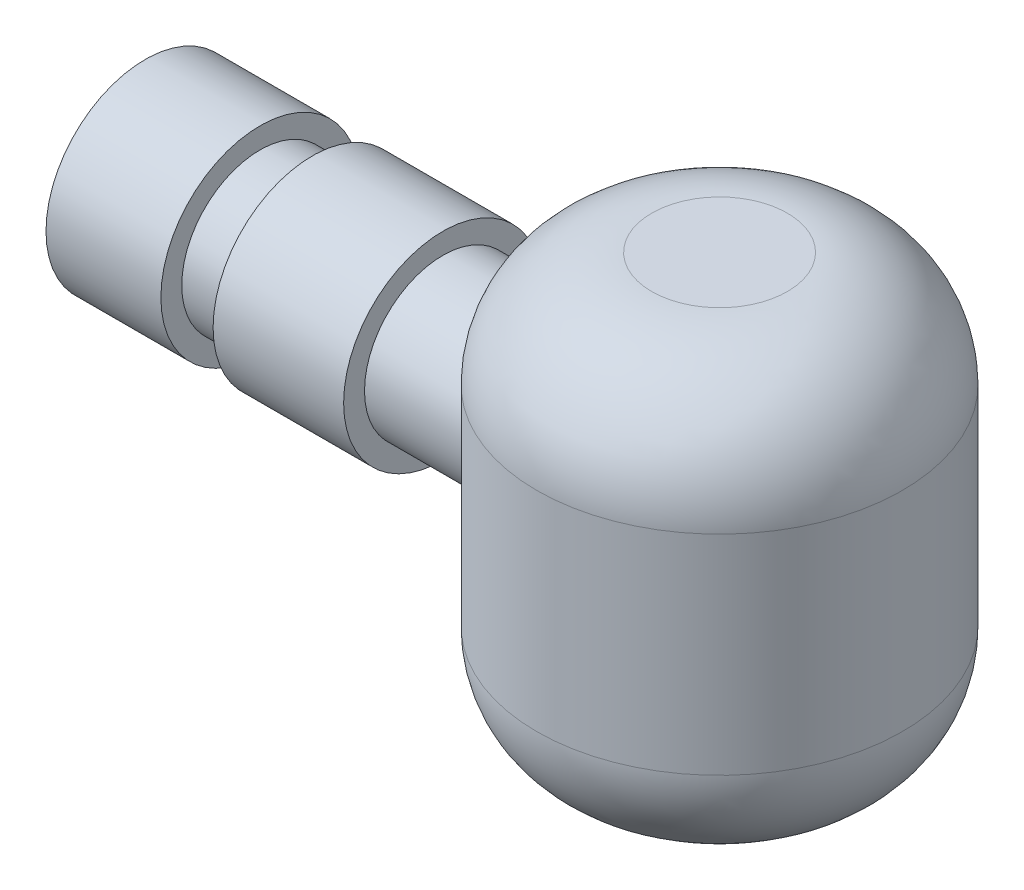
ISO-10303-21;
HEADER;
FILE_DESCRIPTION(('STEP AP214'),'2;1');
FILE_NAME('part.step','',(''),(''),'','','');
FILE_SCHEMA(('AUTOMOTIVE_DESIGN { 1 0 10303 214 1 1 1 1 }'));
ENDSEC;
DATA;
#1=APPLICATION_CONTEXT('core data for automotive mechanical design processes');
#2=APPLICATION_PROTOCOL_DEFINITION('international standard','automotive_design',2000,#1);
#3=PRODUCT_CONTEXT('',#1,'mechanical');
#4=PRODUCT('Part','Part','',(#3));
#5=PRODUCT_RELATED_PRODUCT_CATEGORY('part','',(#4));
#6=PRODUCT_DEFINITION_FORMATION('','',#4);
#7=PRODUCT_DEFINITION_CONTEXT('part definition',#1,'design');
#8=PRODUCT_DEFINITION('design','',#6,#7);
#9=PRODUCT_DEFINITION_SHAPE('','',#8);
#10=(LENGTH_UNIT() NAMED_UNIT(*) SI_UNIT(.MILLI.,.METRE.));
#11=(NAMED_UNIT(*) PLANE_ANGLE_UNIT() SI_UNIT($,.RADIAN.));
#12=(NAMED_UNIT(*) SI_UNIT($,.STERADIAN.) SOLID_ANGLE_UNIT());
#13=UNCERTAINTY_MEASURE_WITH_UNIT(LENGTH_MEASURE(1.E-05),#10,'distance_accuracy_value','');
#14=(GEOMETRIC_REPRESENTATION_CONTEXT(3) GLOBAL_UNCERTAINTY_ASSIGNED_CONTEXT((#13)) GLOBAL_UNIT_ASSIGNED_CONTEXT((#10,
#11,#12)) REPRESENTATION_CONTEXT('',''));
#15=CARTESIAN_POINT('',(0.,0.,0.));
#16=DIRECTION('',(0.,0.,1.));
#17=DIRECTION('',(1.,0.,0.));
#18=AXIS2_PLACEMENT_3D('',#15,#16,#17);
#19=CARTESIAN_POINT('',(0.,0.,0.));
#20=DIRECTION('',(-1.,0.,0.));
#21=DIRECTION('',(0.,0.,1.));
#22=AXIS2_PLACEMENT_3D('',#19,#20,#21);
#23=CYLINDRICAL_SURFACE('',#22,15.);
#24=CARTESIAN_POINT('',(57.,0.,0.));
#25=DIRECTION('',(-1.,0.,0.));
#26=DIRECTION('',(0.,0.,1.));
#27=AXIS2_PLACEMENT_3D('',#24,#25,#26);
#28=CIRCLE('',#27,15.);
#29=CARTESIAN_POINT('',(57.,0.,15.));
#30=VERTEX_POINT('',#29);
#31=EDGE_CURVE('E109',#30,#30,#28,.T.);
#32=ORIENTED_EDGE('',*,*,#31,.F.);
#33=EDGE_LOOP('',(#32));
#34=FACE_BOUND('',#33,.T.);
#35=CARTESIAN_POINT('',(78.3772233983162,0.,15.));
#36=CARTESIAN_POINT('',(78.3772201709718,-0.399001183335583,14.9999969968511));
#37=CARTESIAN_POINT('',(78.3696456536564,-0.798130413369897,14.9840568826533));
#38=CARTESIAN_POINT('',(78.339598879865,-1.59346479897462,14.9204623828455));
#39=CARTESIAN_POINT('',(78.3171172593677,-1.98966795823254,14.8727880630569));
#40=CARTESIAN_POINT('',(78.2579633315386,-2.77692441351318,14.7461180263856));
#41=CARTESIAN_POINT('',(78.2212577918503,-3.16796341514485,14.667048948962));
#42=CARTESIAN_POINT('',(78.1349007942367,-3.94108363111791,14.47847300708));
#43=CARTESIAN_POINT('',(78.0852512356631,-4.3231661507387,14.3689706081257));
#44=CARTESIAN_POINT('',(77.974828160602,-5.07435740685936,14.121142654582));
#45=CARTESIAN_POINT('',(77.9141027213029,-5.4435142993136,13.9829413277954));
#46=CARTESIAN_POINT('',(77.7832019182835,-6.16840331199178,13.6786452027968));
#47=CARTESIAN_POINT('',(77.7130262324898,-6.52413497414176,13.5125494538685));
#48=CARTESIAN_POINT('',(77.5652286051078,-7.22011098071208,13.1538283121292));
#49=CARTESIAN_POINT('',(77.4876101390709,-7.56036244551666,12.9612152839455));
#50=CARTESIAN_POINT('',(77.3269150345877,-8.22400096773268,12.5506225892534));
#51=CARTESIAN_POINT('',(77.2438364119949,-8.5473818171635,12.332633679055));
#52=CARTESIAN_POINT('',(77.0692550857583,-9.1943845973427,11.8588991996377));
#53=CARTESIAN_POINT('',(76.977545483331,-9.51687044145465,11.6016771264714));
#54=CARTESIAN_POINT('',(76.7927936908513,-10.1393747010567,11.0617742192209));
#55=CARTESIAN_POINT('',(76.6997514472618,-10.4393922108772,10.779092359896));
#56=CARTESIAN_POINT('',(76.5146843960135,-11.0154808897307,10.189656298056));
#57=CARTESIAN_POINT('',(76.4226601884721,-11.2915385292898,9.88288867879239));
#58=CARTESIAN_POINT('',(76.2420497290423,-11.8177948771708,9.24715861670067));
#59=CARTESIAN_POINT('',(76.153462305864,-12.0680024446698,8.91820384202699));
#60=CARTESIAN_POINT('',(75.9779273742456,-12.5520782636645,8.22390793669102));
#61=CARTESIAN_POINT('',(75.8912492639278,-12.7846393374165,7.85758519801754));
#62=CARTESIAN_POINT('',(75.7265087339277,-13.2178801797503,7.10466659638137));
#63=CARTESIAN_POINT('',(75.6484466573771,-13.4185586787554,6.7180699269176));
#64=CARTESIAN_POINT('',(75.5032112778766,-13.7861138050678,5.92731639083561));
#65=CARTESIAN_POINT('',(75.4360340138887,-13.9530027341118,5.52316598031051));
#66=CARTESIAN_POINT('',(75.3145292781493,-14.2513317619582,4.70011703639667));
#67=CARTESIAN_POINT('',(75.260200848113,-14.3827745044919,4.28121960554121));
#68=CARTESIAN_POINT('',(75.1686251485824,-14.60253703348,3.45520660091181));
#69=CARTESIAN_POINT('',(75.1306064692851,-14.6928213916103,3.04869879539911));
#70=CARTESIAN_POINT('',(75.0685999294591,-14.8393777707291,2.22853652602407));
#71=CARTESIAN_POINT('',(75.0446116007741,-14.8956509265848,1.81488230109331));
#72=CARTESIAN_POINT('',(75.0113614503789,-14.9735121981736,0.983884258415764));
#73=CARTESIAN_POINT('',(75.0020942439111,-14.9951129965464,0.56654184594743));
#74=CARTESIAN_POINT('',(74.9985400564795,-15.0034069393942,-0.268545781173324));
#75=CARTESIAN_POINT('',(75.0042524542713,-14.9901015315235,-0.686290978402918));
#76=CARTESIAN_POINT('',(75.0296403061608,-14.9307301607985,-1.49190758722782));
#77=CARTESIAN_POINT('',(75.0483926732121,-14.8868295700915,-1.87997004615754));
#78=CARTESIAN_POINT('',(75.0983816176484,-14.7690828584914,-2.65068752524847));
#79=CARTESIAN_POINT('',(75.1296175540277,-14.6952382751576,-3.03334282201192));
#80=CARTESIAN_POINT('',(75.2037999789145,-14.5183324171322,-3.79067999584081));
#81=CARTESIAN_POINT('',(75.2467468696227,-14.4152701389835,-4.16536159858123));
#82=CARTESIAN_POINT('',(75.343310718142,-14.180885296129,-4.90436245078637));
#83=CARTESIAN_POINT('',(75.3969280030458,-14.0495618650892,-5.26868138219998));
#84=CARTESIAN_POINT('',(75.5144589794764,-13.7575676637308,-5.99025205853288));
#85=CARTESIAN_POINT('',(75.5785171957643,-13.5964799636739,-6.34731135665168));
#86=CARTESIAN_POINT('',(75.7148179325863,-13.2476217680826,-7.04650073010013));
#87=CARTESIAN_POINT('',(75.787060470432,-13.0598512161084,-7.38863077384928));
#88=CARTESIAN_POINT('',(75.9380787413515,-12.6589476599106,-8.05621899505986));
#89=CARTESIAN_POINT('',(76.0168551929936,-12.4458118650161,-8.38167533244357));
#90=CARTESIAN_POINT('',(76.1791888234429,-11.9954738422044,-9.01440333523405));
#91=CARTESIAN_POINT('',(76.2627478494575,-11.7582622876077,-9.32166787980064));
#92=CARTESIAN_POINT('',(76.4390352174159,-11.2428311490824,-9.93840787491212));
#93=CARTESIAN_POINT('',(76.5319850888284,-10.9628770046345,-10.2463720816148));
#94=CARTESIAN_POINT('',(76.7188182440577,-10.3785206932134,-10.8378576720054));
#95=CARTESIAN_POINT('',(76.8127015597684,-10.0741176883378,-11.1213782172781));
#96=CARTESIAN_POINT('',(76.9989627757825,-9.4424336983145,-11.6624805864524));
#97=CARTESIAN_POINT('',(77.0913401300224,-9.11514463259448,-11.9200531695472));
#98=CARTESIAN_POINT('',(77.2720470136555,-8.43948288399108,-12.4076070705657));
#99=CARTESIAN_POINT('',(77.3603759255476,-8.09110700345807,-12.6375841880049));
#100=CARTESIAN_POINT('',(77.5335658070309,-7.36201511883854,-13.0762496567549));
#101=CARTESIAN_POINT('',(77.6181799415638,-6.98058105477764,-13.2838446852322));
#102=CARTESIAN_POINT('',(77.7775032462226,-6.19962193364722,-13.6657796022175));
#103=CARTESIAN_POINT('',(77.8522168124694,-5.80010501229212,-13.840134265539));
#104=CARTESIAN_POINT('',(77.9891298611628,-4.98566323643557,-14.1539223059169));
#105=CARTESIAN_POINT('',(78.0513341608332,-4.57074438629785,-14.2933691308016));
#106=CARTESIAN_POINT('',(78.1609142348199,-3.72848779083147,-14.53583039468));
#107=CARTESIAN_POINT('',(78.2082914233147,-3.30115123412876,-14.6388483083079));
#108=CARTESIAN_POINT('',(78.2836941831991,-2.46675388634625,-14.8014667106141));
#109=CARTESIAN_POINT('',(78.3128096625551,-2.06027019438015,-14.8635274435207));
#110=CARTESIAN_POINT('',(78.3554442810834,-1.24276757926147,-14.9540838201044));
#111=CARTESIAN_POINT('',(78.3689641323141,-0.831748864032147,-14.9825809962132));
#112=CARTESIAN_POINT('',(78.379898909309,-0.0086834888937484,-15.0056445843868));
#113=CARTESIAN_POINT('',(78.3773191421055,0.403362787527632,-15.0002221776048));
#114=CARTESIAN_POINT('',(78.3561637102297,1.2251923853368,-14.9555420097749));
#115=CARTESIAN_POINT('',(78.3375885842127,1.634975782461,-14.9162853881186));
#116=CARTESIAN_POINT('',(78.2869668040625,2.42060869813709,-14.8083348100221));
#117=CARTESIAN_POINT('',(78.2559475172658,2.7968352919492,-14.7418793533756));
#118=CARTESIAN_POINT('',(78.1816410728561,3.54194568184146,-14.5808056493169));
#119=CARTESIAN_POINT('',(78.1383546033806,3.91082988855695,-14.486188981616));
#120=CARTESIAN_POINT('',(78.0408055392035,4.63900052532694,-14.2696869378188));
#121=CARTESIAN_POINT('',(77.9865429060506,4.99828692175375,-14.1478014661953));
#122=CARTESIAN_POINT('',(77.8685544589534,5.70538226606215,-13.8777487683778));
#123=CARTESIAN_POINT('',(77.8048249377536,6.05318665205155,-13.7295712417131));
#124=CARTESIAN_POINT('',(77.6667034788499,6.75008844432338,-13.4011569146763));
#125=CARTESIAN_POINT('',(77.5919706839788,7.09859720394612,-13.2198147660064));
#126=CARTESIAN_POINT('',(77.436074792504,7.7794024818561,-12.8310033668757));
#127=CARTESIAN_POINT('',(77.3549088806306,8.1116917982347,-12.6235226539454));
#128=CARTESIAN_POINT('',(77.188245356983,8.7583602811179,-12.183761414326));
#129=CARTESIAN_POINT('',(77.1027470335287,9.07273648692065,-11.9514768061465));
#130=CARTESIAN_POINT('',(76.9295170139452,9.68205454627027,-11.4634289870199));
#131=CARTESIAN_POINT('',(76.8417852118792,9.97699547558675,-11.2076646608942));
#132=CARTESIAN_POINT('',(76.6584721394099,10.5709079111541,-10.6506249648662));
#133=CARTESIAN_POINT('',(76.5628747977212,10.8679799128132,-10.3473256725972));
#134=CARTESIAN_POINT('',(76.3740999478181,11.4355928116429,-9.71633909087293));
#135=CARTESIAN_POINT('',(76.2809216444926,11.706142509693,-9.38865995528571));
#136=CARTESIAN_POINT('',(76.0994140075329,12.2191371442143,-8.71053874237839));
#137=CARTESIAN_POINT('',(76.0110862652014,12.4615728861167,-8.36008927624262));
#138=CARTESIAN_POINT('',(75.8416954800857,12.9164364104178,-7.6385557959372));
#139=CARTESIAN_POINT('',(75.7606322830315,13.1288648301077,-7.26747222022517));
#140=CARTESIAN_POINT('',(75.607611960197,13.5229249635428,-6.50504044902459));
#141=CARTESIAN_POINT('',(75.5357024658227,13.7043971358298,-6.11360008324399));
#142=CARTESIAN_POINT('',(75.4035180793482,14.0335057933495,-5.31481805274861));
#143=CARTESIAN_POINT('',(75.3432433479603,14.1811418112048,-4.90747616847775));
#144=CARTESIAN_POINT('',(75.2361331302649,14.4409295699031,-4.0801280681907));
#145=CARTESIAN_POINT('',(75.1892906577847,14.5530997597949,-3.66012856153301));
#146=CARTESIAN_POINT('',(75.1104294470396,14.7407394809371,-2.81065056812769));
#147=CARTESIAN_POINT('',(75.0784095156627,14.8162119661234,-2.38117284722728));
#148=CARTESIAN_POINT('',(75.0319505050257,14.9253716241129,-1.54810458185719));
#149=CARTESIAN_POINT('',(75.0163954127946,14.9617146675738,-1.14492225015297));
#150=CARTESIAN_POINT('',(74.9992853369982,15.0016786802073,-0.336650930146407));
#151=CARTESIAN_POINT('',(74.9977296319206,15.0053013357513,0.0684379588175136));
#152=CARTESIAN_POINT('',(75.0086595983182,14.9797874349492,0.877316457088052));
#153=CARTESIAN_POINT('',(75.0211428376782,14.9506565528456,1.28110627929407));
#154=CARTESIAN_POINT('',(75.0598065303898,14.8599731162934,2.08435932438543));
#155=CARTESIAN_POINT('',(75.0859868690449,14.7984208333343,2.48382258347186));
#156=CARTESIAN_POINT('',(75.1500555246606,14.6466091376929,3.25990951695596));
#157=CARTESIAN_POINT('',(75.187444277168,14.5575705589587,3.63681443622407));
#158=CARTESIAN_POINT('',(75.2733023132146,14.3510400054925,4.38142946334524));
#159=CARTESIAN_POINT('',(75.3217712087664,14.2335490270545,4.74913989265681));
#160=CARTESIAN_POINT('',(75.4286504163245,13.9711332983224,5.47318347050869));
#161=CARTESIAN_POINT('',(75.4870619269201,13.8262052402325,5.82951524118581));
#162=CARTESIAN_POINT('',(75.6124809426686,13.5100891827298,6.52876162990522));
#163=CARTESIAN_POINT('',(75.6794888096718,13.3389000778393,6.87167568235588));
#164=CARTESIAN_POINT('',(75.8238219682275,12.9631244491982,7.55759351730305));
#165=CARTESIAN_POINT('',(75.9014784098646,12.7573709288559,7.8998882829728));
#166=CARTESIAN_POINT('',(76.0626980023806,12.3199752477937,8.56603740425675));
#167=CARTESIAN_POINT('',(76.1462612932046,12.0883324736299,8.88989132264194));
#168=CARTESIAN_POINT('',(76.3173389339012,11.6005951977803,9.51757199479684));
#169=CARTESIAN_POINT('',(76.4048537275456,11.3444979461258,9.82139648969744));
#170=CARTESIAN_POINT('',(76.5818137251456,10.8092091726578,10.4076237767844));
#171=CARTESIAN_POINT('',(76.6712598184259,10.5300068362418,10.690016417634));
#172=CARTESIAN_POINT('',(76.8564262703985,9.92895006548812,11.2515403576814));
#173=CARTESIAN_POINT('',(76.9521298001866,9.60547042223948,11.5289405856608));
#174=CARTESIAN_POINT('',(77.1405498334568,8.93569669060608,12.0554848286175));
#175=CARTESIAN_POINT('',(77.2332675875615,8.58941234425741,12.3046407871719));
#176=CARTESIAN_POINT('',(77.413127007098,7.87551217774675,12.7733627339575));
#177=CARTESIAN_POINT('',(77.5002636424531,7.50787766881753,12.9929022215854));
#178=CARTESIAN_POINT('',(77.6661574903658,6.75371231023291,13.4004122969142));
#179=CARTESIAN_POINT('',(77.7449152754108,6.36718275422432,13.5883850419304));
#180=CARTESIAN_POINT('',(77.8913133609502,5.57832120206674,13.9307889254821));
#181=CARTESIAN_POINT('',(77.9589730070142,5.17601825155889,14.0852785840056));
#182=CARTESIAN_POINT('',(78.0809517357826,4.35767079750081,14.3595587877867));
#183=CARTESIAN_POINT('',(78.1352684873993,3.9416239071813,14.4793432704868));
#184=CARTESIAN_POINT('',(78.2283469570971,3.10035314613254,14.6824564114534));
#185=CARTESIAN_POINT('',(78.2671547194925,2.67516044967112,14.7658930495296));
#186=CARTESIAN_POINT('',(78.3278758737813,1.81818415638058,14.8956958248103));
#187=CARTESIAN_POINT('',(78.3498022118062,1.38640586963233,14.9420903700977));
#188=CARTESIAN_POINT('',(78.3676385490132,0.794693278858898,14.9797789644521));
#189=CARTESIAN_POINT('',(78.3712300436265,0.635879094260052,14.9873593303334));
#190=CARTESIAN_POINT('',(78.3760231305895,0.318050056089657,14.9974704870267));
#191=CARTESIAN_POINT('',(78.3772246846817,0.159035199346569,15.0000011970049));
#192=CARTESIAN_POINT('',(78.3772233983162,0.,15.));
#193=B_SPLINE_CURVE_WITH_KNOTS('',3,(#35,#36,#37,#38,#39,#40,#41,#42,#43,#44,#45,#46,#47,#48,
#49,#50,#51,#52,#53,#54,#55,#56,#57,#58,#59,#60,#61,#62,#63,#64,#65,#66,#67,#68,#69,#70,#71,#72,
#73,#74,#75,#76,#77,#78,#79,#80,#81,#82,#83,#84,#85,#86,#87,#88,#89,#90,#91,#92,#93,#94,#95,#96,
#97,#98,#99,#100,#101,#102,#103,#104,#105,#106,#107,#108,#109,#110,#111,#112,#113,#114,#115,
#116,#117,#118,#119,#120,#121,#122,#123,#124,#125,#126,#127,#128,#129,#130,#131,#132,#133,#134,
#135,#136,#137,#138,#139,#140,#141,#142,#143,#144,#145,#146,#147,#148,#149,#150,#151,#152,#153,
#154,#155,#156,#157,#158,#159,#160,#161,#162,#163,#164,#165,#166,#167,#168,#169,#170,#171,#172,
#173,#174,#175,#176,#177,#178,#179,#180,#181,#182,#183,#184,#185,#186,#187,#188,#189,#190,#191,
#192),.UNSPECIFIED.,.T.,.F.,(4,2,2,2,2,2,2,2,2,2,2,2,2,2,2,2,2,2,2,2,2,2,2,2,2,2,2,2,2,2,2,2,2,
2,2,2,2,2,2,2,2,2,2,2,2,2,2,2,2,2,2,2,2,2,2,2,2,2,2,2,2,2,2,2,2,2,2,2,2,2,2,2,2,2,2,2,2,2,4),
(0.,1.1968382596353,2.39442903631565,3.59483486528798,4.79506465071825,5.99020348381598,
7.18538305870313,8.38000721419953,9.57506790607814,10.8414089326236,12.1078009763041,
13.3749035261616,14.6415703718178,15.9673413111794,17.2931650300419,18.6185051861055,
19.9437464651555,21.1965415554021,22.4492948407633,23.7015897828441,24.9538327897041,
26.1254164508933,27.2969399614076,28.4685037117832,29.6401033810792,30.8295664188301,
32.0190319725818,33.2086285119134,34.3986876594145,35.6765982926804,36.9545527407355,
38.2329607076411,39.5115630231103,40.8371660990476,42.1621785847435,43.4866798369189,
44.8110547224421,46.0460817156627,47.2810523183195,48.5156158502922,49.7501378090727,
50.8987548691701,52.047307509403,53.1958641732755,54.3448718061436,55.5433331663325,
56.7423219257833,57.9415082842042,59.1407516279639,60.4447784041703,61.7483709907774,
63.0523887174382,64.3563787453906,65.6668985152323,66.9774363861394,68.2872913994947,
69.5970409602444,70.8108492830157,72.0245950471395,73.238130573614,74.4516559383756,
75.6175774270101,76.783458095445,77.949479411287,79.1155498251184,80.3347955458599,
81.5540701626599,82.7734820518445,83.9934679646293,85.3021866112611,86.6103497627714,
87.9196757931969,89.228912306004,90.5358418140301,91.8429994887315,93.146247014446,
94.4484940993412,94.9255261792516,95.4025658953134),.UNSPECIFIED.);
#194=CARTESIAN_POINT('',(78.3772233983162,0.,15.));
#195=VERTEX_POINT('',#194);
#196=EDGE_CURVE('E61',#195,#195,#193,.T.);
#197=ORIENTED_EDGE('',*,*,#196,.F.);
#198=EDGE_LOOP('',(#197));
#199=FACE_BOUND('',#198,.T.);
#200=ADVANCED_FACE('F37',(#34,#199),#23,.T.);
#201=CARTESIAN_POINT('',(0.,0.,0.));
#202=DIRECTION('',(1.,0.,0.));
#203=DIRECTION('',(0.,0.,-1.));
#204=AXIS2_PLACEMENT_3D('',#201,#202,#203);
#205=PLANE('',#204);
#206=CARTESIAN_POINT('',(0.,0.,0.));
#207=DIRECTION('',(-1.,0.,0.));
#208=DIRECTION('',(0.,0.,1.));
#209=AXIS2_PLACEMENT_3D('',#206,#207,#208);
#210=CIRCLE('',#209,16.);
#211=CARTESIAN_POINT('',(0.,0.,16.));
#212=VERTEX_POINT('',#211);
#213=EDGE_CURVE('E122',#212,#212,#210,.T.);
#214=ORIENTED_EDGE('',*,*,#213,.F.);
#215=EDGE_LOOP('',(#214));
#216=FACE_BOUND('',#215,.T.);
#217=CARTESIAN_POINT('',(0.,0.,0.));
#218=DIRECTION('',(-1.,0.,0.));
#219=DIRECTION('',(0.,0.,1.));
#220=AXIS2_PLACEMENT_3D('',#217,#218,#219);
#221=CIRCLE('',#220,19.);
#222=CARTESIAN_POINT('',(0.,0.,19.));
#223=VERTEX_POINT('',#222);
#224=EDGE_CURVE('E70',#223,#223,#221,.T.);
#225=ORIENTED_EDGE('',*,*,#224,.T.);
#226=EDGE_LOOP('',(#225));
#227=FACE_BOUND('',#226,.T.);
#228=ADVANCED_FACE('F98',(#216,#227),#205,.F.);
#229=CARTESIAN_POINT('',(0.,0.,0.));
#230=DIRECTION('',(-1.,0.,0.));
#231=DIRECTION('',(0.,0.,1.));
#232=AXIS2_PLACEMENT_3D('',#229,#230,#231);
#233=CYLINDRICAL_SURFACE('',#232,19.);
#234=ORIENTED_EDGE('',*,*,#224,.F.);
#235=EDGE_LOOP('',(#234));
#236=FACE_BOUND('',#235,.T.);
#237=CARTESIAN_POINT('',(22.,0.,0.));
#238=DIRECTION('',(-1.,0.,0.));
#239=DIRECTION('',(0.,0.,1.));
#240=AXIS2_PLACEMENT_3D('',#237,#238,#239);
#241=CIRCLE('',#240,19.);
#242=CARTESIAN_POINT('',(22.,0.,19.));
#243=VERTEX_POINT('',#242);
#244=EDGE_CURVE('E136',#243,#243,#241,.T.);
#245=ORIENTED_EDGE('',*,*,#244,.T.);
#246=EDGE_LOOP('',(#245));
#247=FACE_BOUND('',#246,.T.);
#248=ADVANCED_FACE('F103',(#236,#247),#233,.T.);
#249=CARTESIAN_POINT('',(22.,19.,0.));
#250=DIRECTION('',(-1.,0.,0.));
#251=DIRECTION('',(0.,0.,1.));
#252=AXIS2_PLACEMENT_3D('',#249,#250,#251);
#253=PLANE('',#252);
#254=ORIENTED_EDGE('',*,*,#244,.F.);
#255=EDGE_LOOP('',(#254));
#256=FACE_BOUND('',#255,.T.);
#257=CARTESIAN_POINT('',(22.,0.,0.));
#258=DIRECTION('',(-1.,0.,0.));
#259=DIRECTION('',(0.,0.,1.));
#260=AXIS2_PLACEMENT_3D('',#257,#258,#259);
#261=CIRCLE('',#260,15.);
#262=CARTESIAN_POINT('',(22.,0.,15.));
#263=VERTEX_POINT('',#262);
#264=EDGE_CURVE('E133',#263,#263,#261,.T.);
#265=ORIENTED_EDGE('',*,*,#264,.T.);
#266=EDGE_LOOP('',(#265));
#267=FACE_BOUND('',#266,.T.);
#268=ADVANCED_FACE('F147',(#256,#267),#253,.F.);
#269=CARTESIAN_POINT('',(0.,0.,0.));
#270=DIRECTION('',(-1.,0.,0.));
#271=DIRECTION('',(0.,0.,1.));
#272=AXIS2_PLACEMENT_3D('',#269,#270,#271);
#273=CYLINDRICAL_SURFACE('',#272,15.);
#274=ORIENTED_EDGE('',*,*,#264,.F.);
#275=EDGE_LOOP('',(#274));
#276=FACE_BOUND('',#275,.T.);
#277=CARTESIAN_POINT('',(32.,0.,0.));
#278=DIRECTION('',(-1.,0.,0.));
#279=DIRECTION('',(0.,0.,1.));
#280=AXIS2_PLACEMENT_3D('',#277,#278,#279);
#281=CIRCLE('',#280,15.);
#282=CARTESIAN_POINT('',(32.,0.,15.));
#283=VERTEX_POINT('',#282);
#284=EDGE_CURVE('E129',#283,#283,#281,.T.);
#285=ORIENTED_EDGE('',*,*,#284,.T.);
#286=EDGE_LOOP('',(#285));
#287=FACE_BOUND('',#286,.T.);
#288=ADVANCED_FACE('F152',(#276,#287),#273,.T.);
#289=CARTESIAN_POINT('',(32.,15.,0.));
#290=DIRECTION('',(1.,0.,0.));
#291=DIRECTION('',(0.,0.,-1.));
#292=AXIS2_PLACEMENT_3D('',#289,#290,#291);
#293=PLANE('',#292);
#294=ORIENTED_EDGE('',*,*,#284,.F.);
#295=EDGE_LOOP('',(#294));
#296=FACE_BOUND('',#295,.T.);
#297=CARTESIAN_POINT('',(32.,0.,0.));
#298=DIRECTION('',(-1.,0.,0.));
#299=DIRECTION('',(0.,0.,1.));
#300=AXIS2_PLACEMENT_3D('',#297,#298,#299);
#301=CIRCLE('',#300,19.);
#302=CARTESIAN_POINT('',(32.,0.,19.));
#303=VERTEX_POINT('',#302);
#304=EDGE_CURVE('E120',#303,#303,#301,.T.);
#305=ORIENTED_EDGE('',*,*,#304,.T.);
#306=EDGE_LOOP('',(#305));
#307=FACE_BOUND('',#306,.T.);
#308=ADVANCED_FACE('F202',(#296,#307),#293,.F.);
#309=CARTESIAN_POINT('',(0.,0.,0.));
#310=DIRECTION('',(-1.,0.,0.));
#311=DIRECTION('',(0.,0.,1.));
#312=AXIS2_PLACEMENT_3D('',#309,#310,#311);
#313=CYLINDRICAL_SURFACE('',#312,19.);
#314=ORIENTED_EDGE('',*,*,#304,.F.);
#315=EDGE_LOOP('',(#314));
#316=FACE_BOUND('',#315,.T.);
#317=CARTESIAN_POINT('',(57.,0.,0.));
#318=DIRECTION('',(-1.,0.,0.));
#319=DIRECTION('',(0.,0.,1.));
#320=AXIS2_PLACEMENT_3D('',#317,#318,#319);
#321=CIRCLE('',#320,19.);
#322=CARTESIAN_POINT('',(57.,0.,19.));
#323=VERTEX_POINT('',#322);
#324=EDGE_CURVE('E114',#323,#323,#321,.T.);
#325=ORIENTED_EDGE('',*,*,#324,.T.);
#326=EDGE_LOOP('',(#325));
#327=FACE_BOUND('',#326,.T.);
#328=ADVANCED_FACE('F210',(#316,#327),#313,.T.);
#329=CARTESIAN_POINT('',(57.,19.,0.));
#330=DIRECTION('',(-1.,0.,0.));
#331=DIRECTION('',(0.,0.,1.));
#332=AXIS2_PLACEMENT_3D('',#329,#330,#331);
#333=PLANE('',#332);
#334=ORIENTED_EDGE('',*,*,#324,.F.);
#335=EDGE_LOOP('',(#334));
#336=FACE_BOUND('',#335,.T.);
#337=ORIENTED_EDGE('',*,*,#31,.T.);
#338=EDGE_LOOP('',(#337));
#339=FACE_BOUND('',#338,.T.);
#340=ADVANCED_FACE('F79',(#336,#339),#333,.F.);
#341=CARTESIAN_POINT('',(110.,42.,0.));
#342=DIRECTION('',(0.,-1.,0.));
#343=DIRECTION('',(0.,0.,-1.));
#344=AXIS2_PLACEMENT_3D('',#341,#342,#343);
#345=CYLINDRICAL_SURFACE('',#344,35.);
#346=CARTESIAN_POINT('',(110.,-20.,0.));
#347=DIRECTION('',(0.,1.,0.));
#348=DIRECTION('',(0.,0.,1.));
#349=AXIS2_PLACEMENT_3D('',#346,#347,#348);
#350=CIRCLE('',#349,35.);
#351=CARTESIAN_POINT('',(110.,-20.,35.));
#352=VERTEX_POINT('',#351);
#353=EDGE_CURVE('E50',#352,#352,#350,.T.);
#354=ORIENTED_EDGE('',*,*,#353,.T.);
#355=EDGE_LOOP('',(#354));
#356=FACE_BOUND('',#355,.T.);
#357=CARTESIAN_POINT('',(110.,20.,0.));
#358=DIRECTION('',(0.,1.,0.));
#359=DIRECTION('',(0.,0.,1.));
#360=AXIS2_PLACEMENT_3D('',#357,#358,#359);
#361=CIRCLE('',#360,35.);
#362=CARTESIAN_POINT('',(110.,20.,35.));
#363=VERTEX_POINT('',#362);
#364=EDGE_CURVE('E55',#363,#363,#361,.F.);
#365=ORIENTED_EDGE('',*,*,#364,.T.);
#366=EDGE_LOOP('',(#365));
#367=FACE_BOUND('',#366,.T.);
#368=ORIENTED_EDGE('',*,*,#196,.T.);
#369=EDGE_LOOP('',(#368));
#370=FACE_BOUND('',#369,.T.);
#371=ADVANCED_FACE('F74',(#356,#367,#370),#345,.T.);
#372=CARTESIAN_POINT('',(110.,42.,0.));
#373=DIRECTION('',(0.,1.,0.));
#374=DIRECTION('',(0.,0.,1.));
#375=AXIS2_PLACEMENT_3D('',#372,#373,#374);
#376=PLANE('',#375);
#377=CARTESIAN_POINT('',(110.,42.,0.));
#378=DIRECTION('',(0.,1.,0.));
#379=DIRECTION('',(0.,0.,1.));
#380=AXIS2_PLACEMENT_3D('',#377,#378,#379);
#381=CIRCLE('',#380,13.);
#382=CARTESIAN_POINT('',(110.,42.,13.));
#383=VERTEX_POINT('',#382);
#384=EDGE_CURVE('E10',#383,#383,#381,.T.);
#385=ORIENTED_EDGE('',*,*,#384,.T.);
#386=EDGE_LOOP('',(#385));
#387=FACE_BOUND('',#386,.T.);
#388=ADVANCED_FACE('F78',(#387),#376,.T.);
#389=CARTESIAN_POINT('',(110.,-42.,0.));
#390=DIRECTION('',(0.,1.,0.));
#391=DIRECTION('',(0.,0.,1.));
#392=AXIS2_PLACEMENT_3D('',#389,#390,#391);
#393=PLANE('',#392);
#394=CARTESIAN_POINT('',(110.,-42.,0.));
#395=DIRECTION('',(0.,1.,0.));
#396=DIRECTION('',(0.,0.,1.));
#397=AXIS2_PLACEMENT_3D('',#394,#395,#396);
#398=CIRCLE('',#397,13.);
#399=CARTESIAN_POINT('',(110.,-42.,13.));
#400=VERTEX_POINT('',#399);
#401=EDGE_CURVE('E45',#400,#400,#398,.F.);
#402=ORIENTED_EDGE('',*,*,#401,.T.);
#403=EDGE_LOOP('',(#402));
#404=FACE_BOUND('',#403,.T.);
#405=ADVANCED_FACE('F81',(#404),#393,.F.);
#406=CARTESIAN_POINT('',(110.,-20.,0.));
#407=DIRECTION('',(0.,1.,0.));
#408=DIRECTION('',(0.,0.,1.));
#409=AXIS2_PLACEMENT_3D('',#406,#407,#408);
#410=DEGENERATE_TOROIDAL_SURFACE('',#409,13.,22.,.T.);
#411=ORIENTED_EDGE('',*,*,#401,.F.);
#412=EDGE_LOOP('',(#411));
#413=FACE_BOUND('',#412,.T.);
#414=ORIENTED_EDGE('',*,*,#353,.F.);
#415=EDGE_LOOP('',(#414));
#416=FACE_BOUND('',#415,.T.);
#417=ADVANCED_FACE('F84',(#413,#416),#410,.T.);
#418=CARTESIAN_POINT('',(110.,20.,0.));
#419=DIRECTION('',(0.,1.,0.));
#420=DIRECTION('',(0.,0.,1.));
#421=AXIS2_PLACEMENT_3D('',#418,#419,#420);
#422=DEGENERATE_TOROIDAL_SURFACE('',#421,13.,22.,.T.);
#423=ORIENTED_EDGE('',*,*,#364,.F.);
#424=EDGE_LOOP('',(#423));
#425=FACE_BOUND('',#424,.T.);
#426=ORIENTED_EDGE('',*,*,#384,.F.);
#427=EDGE_LOOP('',(#426));
#428=FACE_BOUND('',#427,.T.);
#429=ADVANCED_FACE('F39',(#425,#428),#422,.T.);
#430=CARTESIAN_POINT('',(20.,0.,0.));
#431=DIRECTION('',(-1.,0.,0.));
#432=DIRECTION('',(0.,0.,1.));
#433=AXIS2_PLACEMENT_3D('',#430,#431,#432);
#434=CYLINDRICAL_SURFACE('',#433,16.);
#435=CARTESIAN_POINT('',(20.,0.,0.));
#436=DIRECTION('',(-1.,0.,0.));
#437=DIRECTION('',(0.,0.,1.));
#438=AXIS2_PLACEMENT_3D('',#435,#436,#437);
#439=CIRCLE('',#438,16.);
#440=CARTESIAN_POINT('',(20.,0.,16.));
#441=VERTEX_POINT('',#440);
#442=EDGE_CURVE('E115',#441,#441,#439,.T.);
#443=ORIENTED_EDGE('',*,*,#442,.F.);
#444=EDGE_LOOP('',(#443));
#445=FACE_BOUND('',#444,.T.);
#446=ORIENTED_EDGE('',*,*,#213,.T.);
#447=EDGE_LOOP('',(#446));
#448=FACE_BOUND('',#447,.T.);
#449=ADVANCED_FACE('F87',(#445,#448),#434,.F.);
#450=CARTESIAN_POINT('',(20.,0.,0.));
#451=DIRECTION('',(-1.,0.,0.));
#452=DIRECTION('',(0.,0.,1.));
#453=AXIS2_PLACEMENT_3D('',#450,#451,#452);
#454=PLANE('',#453);
#455=ORIENTED_EDGE('',*,*,#442,.T.);
#456=EDGE_LOOP('',(#455));
#457=FACE_BOUND('',#456,.T.);
#458=ADVANCED_FACE('F90',(#457),#454,.T.);
#459=CLOSED_SHELL('',(#200,#228,#248,#268,#288,#308,#328,#340,#371,#388,#405,#417,#429,#449,#458));
#460=MANIFOLD_SOLID_BREP('B2',#459);
#461=ADVANCED_BREP_SHAPE_REPRESENTATION('',(#18,#460),#14);
#462=SHAPE_DEFINITION_REPRESENTATION(#9,#461);
ENDSEC;
END-ISO-10303-21;
